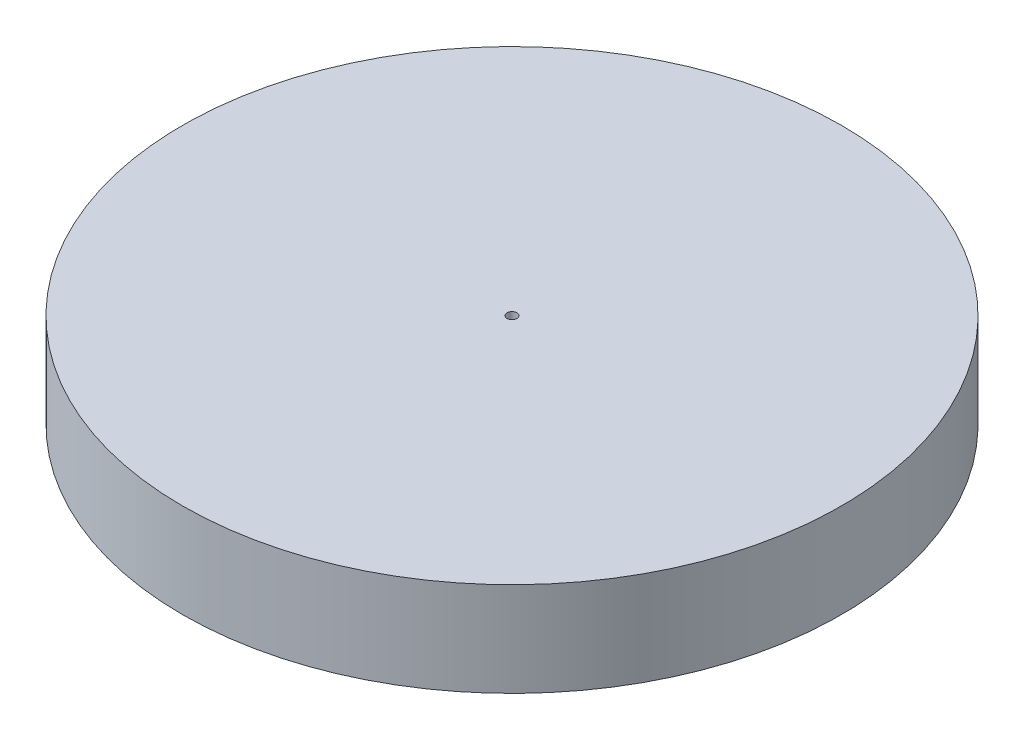
ISO-10303-21;
HEADER;
FILE_DESCRIPTION(('STEP AP214'),'2;1');
FILE_NAME('part.step','',(''),(''),'','','');
FILE_SCHEMA(('AUTOMOTIVE_DESIGN { 1 0 10303 214 1 1 1 1 }'));
ENDSEC;
DATA;
#1=APPLICATION_CONTEXT('core data for automotive mechanical design processes');
#2=APPLICATION_PROTOCOL_DEFINITION('international standard','automotive_design',2000,#1);
#3=PRODUCT_CONTEXT('',#1,'mechanical');
#4=PRODUCT('Part','Part','',(#3));
#5=PRODUCT_RELATED_PRODUCT_CATEGORY('part','',(#4));
#6=PRODUCT_DEFINITION_FORMATION('','',#4);
#7=PRODUCT_DEFINITION_CONTEXT('part definition',#1,'design');
#8=PRODUCT_DEFINITION('design','',#6,#7);
#9=PRODUCT_DEFINITION_SHAPE('','',#8);
#10=(LENGTH_UNIT() NAMED_UNIT(*) SI_UNIT(.MILLI.,.METRE.));
#11=(NAMED_UNIT(*) PLANE_ANGLE_UNIT() SI_UNIT($,.RADIAN.));
#12=(NAMED_UNIT(*) SI_UNIT($,.STERADIAN.) SOLID_ANGLE_UNIT());
#13=UNCERTAINTY_MEASURE_WITH_UNIT(LENGTH_MEASURE(1.E-05),#10,'distance_accuracy_value','');
#14=(GEOMETRIC_REPRESENTATION_CONTEXT(3) GLOBAL_UNCERTAINTY_ASSIGNED_CONTEXT((#13)) GLOBAL_UNIT_ASSIGNED_CONTEXT((#10,
#11,#12)) REPRESENTATION_CONTEXT('',''));
#15=CARTESIAN_POINT('',(0.,0.,0.));
#16=DIRECTION('',(0.,0.,1.));
#17=DIRECTION('',(1.,0.,0.));
#18=AXIS2_PLACEMENT_3D('',#15,#16,#17);
#19=CARTESIAN_POINT('',(0.,30.,0.));
#20=DIRECTION('',(0.,1.,0.));
#21=DIRECTION('',(0.,0.,1.));
#22=AXIS2_PLACEMENT_3D('',#19,#20,#21);
#23=PLANE('',#22);
#24=CARTESIAN_POINT('',(0.,30.,0.));
#25=DIRECTION('',(0.,1.,0.));
#26=DIRECTION('',(0.,0.,1.));
#27=AXIS2_PLACEMENT_3D('',#24,#25,#26);
#28=CIRCLE('',#27,105.);
#29=CARTESIAN_POINT('',(0.,30.,105.));
#30=VERTEX_POINT('',#29);
#31=EDGE_CURVE('E10',#30,#30,#28,.T.);
#32=ORIENTED_EDGE('',*,*,#31,.T.);
#33=EDGE_LOOP('',(#32));
#34=FACE_BOUND('',#33,.T.);
#35=CARTESIAN_POINT('',(0.,30.,0.));
#36=DIRECTION('',(0.,1.,0.));
#37=DIRECTION('',(0.,0.,1.));
#38=AXIS2_PLACEMENT_3D('',#35,#36,#37);
#39=CIRCLE('',#38,1.575);
#40=CARTESIAN_POINT('',(0.,30.,1.575));
#41=VERTEX_POINT('',#40);
#42=EDGE_CURVE('E39',#41,#41,#39,.T.);
#43=ORIENTED_EDGE('',*,*,#42,.F.);
#44=EDGE_LOOP('',(#43));
#45=FACE_BOUND('',#44,.T.);
#46=ADVANCED_FACE('F28',(#34,#45),#23,.T.);
#47=CARTESIAN_POINT('',(0.,0.,0.));
#48=DIRECTION('',(0.,1.,0.));
#49=DIRECTION('',(0.,0.,1.));
#50=AXIS2_PLACEMENT_3D('',#47,#48,#49);
#51=PLANE('',#50);
#52=CARTESIAN_POINT('',(0.,0.,0.));
#53=DIRECTION('',(0.,1.,0.));
#54=DIRECTION('',(0.,0.,1.));
#55=AXIS2_PLACEMENT_3D('',#52,#53,#54);
#56=CIRCLE('',#55,105.);
#57=CARTESIAN_POINT('',(0.,0.,105.));
#58=VERTEX_POINT('',#57);
#59=EDGE_CURVE('E32',#58,#58,#56,.T.);
#60=ORIENTED_EDGE('',*,*,#59,.F.);
#61=EDGE_LOOP('',(#60));
#62=FACE_BOUND('',#61,.T.);
#63=CARTESIAN_POINT('',(0.,0.,0.));
#64=DIRECTION('',(0.,1.,0.));
#65=DIRECTION('',(0.,0.,1.));
#66=AXIS2_PLACEMENT_3D('',#63,#64,#65);
#67=CIRCLE('',#66,1.575);
#68=CARTESIAN_POINT('',(0.,0.,1.575));
#69=VERTEX_POINT('',#68);
#70=EDGE_CURVE('E41',#69,#69,#67,.T.);
#71=ORIENTED_EDGE('',*,*,#70,.T.);
#72=EDGE_LOOP('',(#71));
#73=FACE_BOUND('',#72,.T.);
#74=ADVANCED_FACE('F51',(#62,#73),#51,.F.);
#75=CARTESIAN_POINT('',(0.,30.,0.));
#76=DIRECTION('',(0.,-1.,0.));
#77=DIRECTION('',(0.,0.,-1.));
#78=AXIS2_PLACEMENT_3D('',#75,#76,#77);
#79=CYLINDRICAL_SURFACE('',#78,105.);
#80=ORIENTED_EDGE('',*,*,#31,.F.);
#81=EDGE_LOOP('',(#80));
#82=FACE_BOUND('',#81,.T.);
#83=ORIENTED_EDGE('',*,*,#59,.T.);
#84=EDGE_LOOP('',(#83));
#85=FACE_BOUND('',#84,.T.);
#86=ADVANCED_FACE('F30',(#82,#85),#79,.T.);
#87=CARTESIAN_POINT('',(0.,30.,0.));
#88=DIRECTION('',(0.,-1.,0.));
#89=DIRECTION('',(0.,0.,-1.));
#90=AXIS2_PLACEMENT_3D('',#87,#88,#89);
#91=CYLINDRICAL_SURFACE('',#90,1.575);
#92=ORIENTED_EDGE('',*,*,#42,.T.);
#93=EDGE_LOOP('',(#92));
#94=FACE_BOUND('',#93,.T.);
#95=ORIENTED_EDGE('',*,*,#70,.F.);
#96=EDGE_LOOP('',(#95));
#97=FACE_BOUND('',#96,.T.);
#98=ADVANCED_FACE('F47',(#94,#97),#91,.F.);
#99=CLOSED_SHELL('',(#46,#74,#86,#98));
#100=MANIFOLD_SOLID_BREP('B2',#99);
#101=ADVANCED_BREP_SHAPE_REPRESENTATION('',(#18,#100),#14);
#102=SHAPE_DEFINITION_REPRESENTATION(#9,#101);
ENDSEC;
END-ISO-10303-21;
